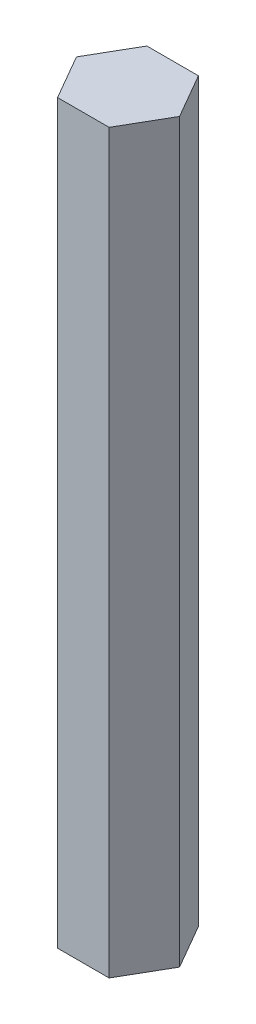
ISO-10303-21;
HEADER;
FILE_DESCRIPTION(('STEP AP214'),'2;1');
FILE_NAME('part.step','',(''),(''),'','','');
FILE_SCHEMA(('AUTOMOTIVE_DESIGN { 1 0 10303 214 1 1 1 1 }'));
ENDSEC;
DATA;
#1=APPLICATION_CONTEXT('core data for automotive mechanical design processes');
#2=APPLICATION_PROTOCOL_DEFINITION('international standard','automotive_design',2000,#1);
#3=PRODUCT_CONTEXT('',#1,'mechanical');
#4=PRODUCT('Part','Part','',(#3));
#5=PRODUCT_RELATED_PRODUCT_CATEGORY('part','',(#4));
#6=PRODUCT_DEFINITION_FORMATION('','',#4);
#7=PRODUCT_DEFINITION_CONTEXT('part definition',#1,'design');
#8=PRODUCT_DEFINITION('design','',#6,#7);
#9=PRODUCT_DEFINITION_SHAPE('','',#8);
#10=(LENGTH_UNIT() NAMED_UNIT(*) SI_UNIT(.MILLI.,.METRE.));
#11=(NAMED_UNIT(*) PLANE_ANGLE_UNIT() SI_UNIT($,.RADIAN.));
#12=(NAMED_UNIT(*) SI_UNIT($,.STERADIAN.) SOLID_ANGLE_UNIT());
#13=UNCERTAINTY_MEASURE_WITH_UNIT(LENGTH_MEASURE(1.E-05),#10,'distance_accuracy_value','');
#14=(GEOMETRIC_REPRESENTATION_CONTEXT(3) GLOBAL_UNCERTAINTY_ASSIGNED_CONTEXT((#13)) GLOBAL_UNIT_ASSIGNED_CONTEXT((#10,
#11,#12)) REPRESENTATION_CONTEXT('',''));
#15=CARTESIAN_POINT('',(0.,0.,0.));
#16=DIRECTION('',(0.,0.,1.));
#17=DIRECTION('',(1.,0.,0.));
#18=AXIS2_PLACEMENT_3D('',#15,#16,#17);
#19=CARTESIAN_POINT('',(7.33234841870824,104.775,0.));
#20=DIRECTION('',(-0.866025403784439,0.,0.5));
#21=DIRECTION('',(0.5,0.,0.866025403784439));
#22=AXIS2_PLACEMENT_3D('',#19,#20,#21);
#23=PLANE('',#22);
#24=DIRECTION('',(-0.5,0.,-0.866025403784439));
#25=VECTOR('',#24,1.);
#26=CARTESIAN_POINT('',(7.33234841870824,0.,0.));
#27=LINE('',#26,#25);
#28=CARTESIAN_POINT('',(7.33234841870824,0.,0.));
#29=VERTEX_POINT('',#28);
#30=CARTESIAN_POINT('',(3.66617420935411,0.,-6.35000000000002));
#31=VERTEX_POINT('',#30);
#32=EDGE_CURVE('E116',#29,#31,#27,.T.);
#33=ORIENTED_EDGE('',*,*,#32,.T.);
#34=DIRECTION('',(0.,-1.,0.));
#35=VECTOR('',#34,1.);
#36=CARTESIAN_POINT('',(3.66617420935411,104.775,-6.35000000000002));
#37=LINE('',#36,#35);
#38=CARTESIAN_POINT('',(3.66617420935411,104.775,-6.35000000000002));
#39=VERTEX_POINT('',#38);
#40=EDGE_CURVE('E11',#39,#31,#37,.T.);
#41=ORIENTED_EDGE('',*,*,#40,.F.);
#42=DIRECTION('',(-0.5,0.,-0.866025403784439));
#43=VECTOR('',#42,1.);
#44=CARTESIAN_POINT('',(7.33234841870824,104.775,0.));
#45=LINE('',#44,#43);
#46=CARTESIAN_POINT('',(7.33234841870824,104.775,0.));
#47=VERTEX_POINT('',#46);
#48=EDGE_CURVE('E126',#47,#39,#45,.T.);
#49=ORIENTED_EDGE('',*,*,#48,.F.);
#50=DIRECTION('',(0.,-1.,0.));
#51=VECTOR('',#50,1.);
#52=CARTESIAN_POINT('',(7.33234841870824,104.775,0.));
#53=LINE('',#52,#51);
#54=EDGE_CURVE('E112',#47,#29,#53,.T.);
#55=ORIENTED_EDGE('',*,*,#54,.T.);
#56=EDGE_LOOP('',(#33,#41,#49,#55));
#57=FACE_BOUND('',#56,.T.);
#58=ADVANCED_FACE('F32',(#57),#23,.F.);
#59=CARTESIAN_POINT('',(3.66617420935411,104.775,-6.35000000000002));
#60=DIRECTION('',(0.,0.,1.));
#61=DIRECTION('',(1.,0.,0.));
#62=AXIS2_PLACEMENT_3D('',#59,#60,#61);
#63=PLANE('',#62);
#64=DIRECTION('',(-1.,0.,0.));
#65=VECTOR('',#64,1.);
#66=CARTESIAN_POINT('',(3.66617420935411,0.,-6.35000000000002));
#67=LINE('',#66,#65);
#68=CARTESIAN_POINT('',(-3.66617420935413,0.,-6.35000000000002));
#69=VERTEX_POINT('',#68);
#70=EDGE_CURVE('E119',#31,#69,#67,.T.);
#71=ORIENTED_EDGE('',*,*,#70,.T.);
#72=DIRECTION('',(0.,-1.,0.));
#73=VECTOR('',#72,1.);
#74=CARTESIAN_POINT('',(-3.66617420935413,104.775,-6.35000000000002));
#75=LINE('',#74,#73);
#76=CARTESIAN_POINT('',(-3.66617420935413,104.775,-6.35000000000002));
#77=VERTEX_POINT('',#76);
#78=EDGE_CURVE('E40',#77,#69,#75,.T.);
#79=ORIENTED_EDGE('',*,*,#78,.F.);
#80=DIRECTION('',(-1.,0.,0.));
#81=VECTOR('',#80,1.);
#82=CARTESIAN_POINT('',(3.66617420935411,104.775,-6.35000000000002));
#83=LINE('',#82,#81);
#84=EDGE_CURVE('E85',#39,#77,#83,.T.);
#85=ORIENTED_EDGE('',*,*,#84,.F.);
#86=ORIENTED_EDGE('',*,*,#40,.T.);
#87=EDGE_LOOP('',(#71,#79,#85,#86));
#88=FACE_BOUND('',#87,.T.);
#89=ADVANCED_FACE('F150',(#88),#63,.F.);
#90=CARTESIAN_POINT('',(-3.66617420935413,104.775,-6.35000000000002));
#91=DIRECTION('',(0.866025403784439,0.,0.5));
#92=DIRECTION('',(0.5,0.,-0.866025403784439));
#93=AXIS2_PLACEMENT_3D('',#90,#91,#92);
#94=PLANE('',#93);
#95=DIRECTION('',(-0.5,0.,0.866025403784439));
#96=VECTOR('',#95,1.);
#97=CARTESIAN_POINT('',(-3.66617420935413,0.,-6.35000000000002));
#98=LINE('',#97,#96);
#99=CARTESIAN_POINT('',(-7.33234841870826,0.,0.));
#100=VERTEX_POINT('',#99);
#101=EDGE_CURVE('E121',#69,#100,#98,.T.);
#102=ORIENTED_EDGE('',*,*,#101,.T.);
#103=DIRECTION('',(0.,-1.,0.));
#104=VECTOR('',#103,1.);
#105=CARTESIAN_POINT('',(-7.33234841870826,104.775,0.));
#106=LINE('',#105,#104);
#107=CARTESIAN_POINT('',(-7.33234841870826,104.775,0.));
#108=VERTEX_POINT('',#107);
#109=EDGE_CURVE('E107',#108,#100,#106,.T.);
#110=ORIENTED_EDGE('',*,*,#109,.F.);
#111=DIRECTION('',(-0.5,0.,0.866025403784439));
#112=VECTOR('',#111,1.);
#113=CARTESIAN_POINT('',(-3.66617420935413,104.775,-6.35000000000002));
#114=LINE('',#113,#112);
#115=EDGE_CURVE('E98',#77,#108,#114,.T.);
#116=ORIENTED_EDGE('',*,*,#115,.F.);
#117=ORIENTED_EDGE('',*,*,#78,.T.);
#118=EDGE_LOOP('',(#102,#110,#116,#117));
#119=FACE_BOUND('',#118,.T.);
#120=ADVANCED_FACE('F132',(#119),#94,.F.);
#121=CARTESIAN_POINT('',(-7.33234841870826,104.775,0.));
#122=DIRECTION('',(0.866025403784439,0.,-0.5));
#123=DIRECTION('',(-0.5,0.,-0.866025403784439));
#124=AXIS2_PLACEMENT_3D('',#121,#122,#123);
#125=PLANE('',#124);
#126=DIRECTION('',(0.5,0.,0.866025403784439));
#127=VECTOR('',#126,1.);
#128=CARTESIAN_POINT('',(-7.33234841870826,0.,0.));
#129=LINE('',#128,#127);
#130=CARTESIAN_POINT('',(-3.66617420935413,0.,6.35000000000001));
#131=VERTEX_POINT('',#130);
#132=EDGE_CURVE('E106',#100,#131,#129,.T.);
#133=ORIENTED_EDGE('',*,*,#132,.T.);
#134=DIRECTION('',(0.,-1.,0.));
#135=VECTOR('',#134,1.);
#136=CARTESIAN_POINT('',(-3.66617420935413,104.775,6.35000000000001));
#137=LINE('',#136,#135);
#138=CARTESIAN_POINT('',(-3.66617420935413,104.775,6.35000000000001));
#139=VERTEX_POINT('',#138);
#140=EDGE_CURVE('E103',#139,#131,#137,.T.);
#141=ORIENTED_EDGE('',*,*,#140,.F.);
#142=DIRECTION('',(0.5,0.,0.866025403784439));
#143=VECTOR('',#142,1.);
#144=CARTESIAN_POINT('',(-7.33234841870826,104.775,0.));
#145=LINE('',#144,#143);
#146=EDGE_CURVE('E92',#108,#139,#145,.T.);
#147=ORIENTED_EDGE('',*,*,#146,.F.);
#148=ORIENTED_EDGE('',*,*,#109,.T.);
#149=EDGE_LOOP('',(#133,#141,#147,#148));
#150=FACE_BOUND('',#149,.T.);
#151=ADVANCED_FACE('F104',(#150),#125,.F.);
#152=CARTESIAN_POINT('',(-3.66617420935413,104.775,6.35000000000001));
#153=DIRECTION('',(0.,0.,-1.));
#154=DIRECTION('',(-1.,0.,0.));
#155=AXIS2_PLACEMENT_3D('',#152,#153,#154);
#156=PLANE('',#155);
#157=DIRECTION('',(1.,0.,0.));
#158=VECTOR('',#157,1.);
#159=CARTESIAN_POINT('',(-3.66617420935413,0.,6.35000000000001));
#160=LINE('',#159,#158);
#161=CARTESIAN_POINT('',(3.66617420935412,0.,6.35000000000001));
#162=VERTEX_POINT('',#161);
#163=EDGE_CURVE('E71',#131,#162,#160,.T.);
#164=ORIENTED_EDGE('',*,*,#163,.T.);
#165=DIRECTION('',(0.,-1.,0.));
#166=VECTOR('',#165,1.);
#167=CARTESIAN_POINT('',(3.66617420935412,104.775,6.35000000000001));
#168=LINE('',#167,#166);
#169=CARTESIAN_POINT('',(3.66617420935412,104.775,6.35000000000001));
#170=VERTEX_POINT('',#169);
#171=EDGE_CURVE('E108',#170,#162,#168,.T.);
#172=ORIENTED_EDGE('',*,*,#171,.F.);
#173=DIRECTION('',(1.,0.,0.));
#174=VECTOR('',#173,1.);
#175=CARTESIAN_POINT('',(-3.66617420935413,104.775,6.35000000000001));
#176=LINE('',#175,#174);
#177=EDGE_CURVE('E96',#139,#170,#176,.T.);
#178=ORIENTED_EDGE('',*,*,#177,.F.);
#179=ORIENTED_EDGE('',*,*,#140,.T.);
#180=EDGE_LOOP('',(#164,#172,#178,#179));
#181=FACE_BOUND('',#180,.T.);
#182=ADVANCED_FACE('F110',(#181),#156,.F.);
#183=CARTESIAN_POINT('',(3.66617420935412,104.775,6.35000000000001));
#184=DIRECTION('',(-0.866025403784439,0.,-0.5));
#185=DIRECTION('',(-0.5,0.,0.866025403784439));
#186=AXIS2_PLACEMENT_3D('',#183,#184,#185);
#187=PLANE('',#186);
#188=DIRECTION('',(0.5,0.,-0.866025403784439));
#189=VECTOR('',#188,1.);
#190=CARTESIAN_POINT('',(3.66617420935412,0.,6.35000000000001));
#191=LINE('',#190,#189);
#192=EDGE_CURVE('E77',#162,#29,#191,.T.);
#193=ORIENTED_EDGE('',*,*,#192,.T.);
#194=ORIENTED_EDGE('',*,*,#54,.F.);
#195=DIRECTION('',(0.5,0.,-0.866025403784439));
#196=VECTOR('',#195,1.);
#197=CARTESIAN_POINT('',(3.66617420935412,104.775,6.35000000000001));
#198=LINE('',#197,#196);
#199=EDGE_CURVE('E48',#170,#47,#198,.T.);
#200=ORIENTED_EDGE('',*,*,#199,.F.);
#201=ORIENTED_EDGE('',*,*,#171,.T.);
#202=EDGE_LOOP('',(#193,#194,#200,#201));
#203=FACE_BOUND('',#202,.T.);
#204=ADVANCED_FACE('F139',(#203),#187,.F.);
#205=CARTESIAN_POINT('',(0.,104.775,0.));
#206=DIRECTION('',(0.,1.,0.));
#207=DIRECTION('',(0.,0.,1.));
#208=AXIS2_PLACEMENT_3D('',#205,#206,#207);
#209=PLANE('',#208);
#210=ORIENTED_EDGE('',*,*,#48,.T.);
#211=ORIENTED_EDGE('',*,*,#84,.T.);
#212=ORIENTED_EDGE('',*,*,#115,.T.);
#213=ORIENTED_EDGE('',*,*,#146,.T.);
#214=ORIENTED_EDGE('',*,*,#177,.T.);
#215=ORIENTED_EDGE('',*,*,#199,.T.);
#216=EDGE_LOOP('',(#210,#211,#212,#213,#214,#215));
#217=FACE_BOUND('',#216,.T.);
#218=ADVANCED_FACE('F94',(#217),#209,.T.);
#219=CARTESIAN_POINT('',(0.,0.,0.));
#220=DIRECTION('',(0.,1.,0.));
#221=DIRECTION('',(0.,0.,1.));
#222=AXIS2_PLACEMENT_3D('',#219,#220,#221);
#223=PLANE('',#222);
#224=ORIENTED_EDGE('',*,*,#32,.F.);
#225=ORIENTED_EDGE('',*,*,#192,.F.);
#226=ORIENTED_EDGE('',*,*,#163,.F.);
#227=ORIENTED_EDGE('',*,*,#132,.F.);
#228=ORIENTED_EDGE('',*,*,#101,.F.);
#229=ORIENTED_EDGE('',*,*,#70,.F.);
#230=EDGE_LOOP('',(#224,#225,#226,#227,#228,#229));
#231=FACE_BOUND('',#230,.T.);
#232=ADVANCED_FACE('F135',(#231),#223,.F.);
#233=CLOSED_SHELL('',(#58,#89,#120,#151,#182,#204,#218,#232));
#234=MANIFOLD_SOLID_BREP('B2',#233);
#235=ADVANCED_BREP_SHAPE_REPRESENTATION('',(#18,#234),#14);
#236=SHAPE_DEFINITION_REPRESENTATION(#9,#235);
ENDSEC;
END-ISO-10303-21;
